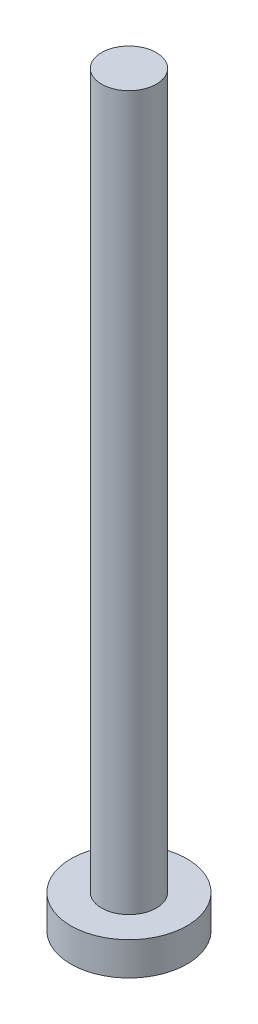
ISO-10303-21;
HEADER;
FILE_DESCRIPTION(('STEP AP214'),'2;1');
FILE_NAME('part.step','',(''),(''),'','','');
FILE_SCHEMA(('AUTOMOTIVE_DESIGN { 1 0 10303 214 1 1 1 1 }'));
ENDSEC;
DATA;
#1=APPLICATION_CONTEXT('core data for automotive mechanical design processes');
#2=APPLICATION_PROTOCOL_DEFINITION('international standard','automotive_design',2000,#1);
#3=PRODUCT_CONTEXT('',#1,'mechanical');
#4=PRODUCT('Part','Part','',(#3));
#5=PRODUCT_RELATED_PRODUCT_CATEGORY('part','',(#4));
#6=PRODUCT_DEFINITION_FORMATION('','',#4);
#7=PRODUCT_DEFINITION_CONTEXT('part definition',#1,'design');
#8=PRODUCT_DEFINITION('design','',#6,#7);
#9=PRODUCT_DEFINITION_SHAPE('','',#8);
#10=(LENGTH_UNIT() NAMED_UNIT(*) SI_UNIT(.MILLI.,.METRE.));
#11=(NAMED_UNIT(*) PLANE_ANGLE_UNIT() SI_UNIT($,.RADIAN.));
#12=(NAMED_UNIT(*) SI_UNIT($,.STERADIAN.) SOLID_ANGLE_UNIT());
#13=UNCERTAINTY_MEASURE_WITH_UNIT(LENGTH_MEASURE(1.E-05),#10,'distance_accuracy_value','');
#14=(GEOMETRIC_REPRESENTATION_CONTEXT(3) GLOBAL_UNCERTAINTY_ASSIGNED_CONTEXT((#13)) GLOBAL_UNIT_ASSIGNED_CONTEXT((#10,
#11,#12)) REPRESENTATION_CONTEXT('',''));
#15=CARTESIAN_POINT('',(0.,0.,0.));
#16=DIRECTION('',(0.,0.,1.));
#17=DIRECTION('',(1.,0.,0.));
#18=AXIS2_PLACEMENT_3D('',#15,#16,#17);
#19=CARTESIAN_POINT('',(0.,4.,0.));
#20=DIRECTION('',(0.,-1.,0.));
#21=DIRECTION('',(0.,0.,-1.));
#22=AXIS2_PLACEMENT_3D('',#19,#20,#21);
#23=CYLINDRICAL_SURFACE('',#22,7.);
#24=CARTESIAN_POINT('',(0.,4.,0.));
#25=DIRECTION('',(0.,1.,0.));
#26=DIRECTION('',(0.,0.,1.));
#27=AXIS2_PLACEMENT_3D('',#24,#25,#26);
#28=CIRCLE('',#27,7.);
#29=CARTESIAN_POINT('',(0.,4.,7.));
#30=VERTEX_POINT('',#29);
#31=EDGE_CURVE('E51',#30,#30,#28,.T.);
#32=ORIENTED_EDGE('',*,*,#31,.F.);
#33=EDGE_LOOP('',(#32));
#34=FACE_BOUND('',#33,.T.);
#35=CARTESIAN_POINT('',(0.,0.,0.));
#36=DIRECTION('',(0.,1.,0.));
#37=DIRECTION('',(0.,0.,1.));
#38=AXIS2_PLACEMENT_3D('',#35,#36,#37);
#39=CIRCLE('',#38,7.);
#40=CARTESIAN_POINT('',(0.,0.,7.));
#41=VERTEX_POINT('',#40);
#42=EDGE_CURVE('E46',#41,#41,#39,.T.);
#43=ORIENTED_EDGE('',*,*,#42,.T.);
#44=EDGE_LOOP('',(#43));
#45=FACE_BOUND('',#44,.T.);
#46=ADVANCED_FACE('F43',(#34,#45),#23,.T.);
#47=CARTESIAN_POINT('',(0.,4.,0.));
#48=DIRECTION('',(0.,1.,0.));
#49=DIRECTION('',(0.,0.,1.));
#50=AXIS2_PLACEMENT_3D('',#47,#48,#49);
#51=PLANE('',#50);
#52=CARTESIAN_POINT('',(0.,4.,0.));
#53=DIRECTION('',(0.,1.,0.));
#54=DIRECTION('',(0.,0.,1.));
#55=AXIS2_PLACEMENT_3D('',#52,#53,#54);
#56=CIRCLE('',#55,3.3);
#57=CARTESIAN_POINT('',(0.,4.,3.3));
#58=VERTEX_POINT('',#57);
#59=EDGE_CURVE('E10',#58,#58,#56,.T.);
#60=ORIENTED_EDGE('',*,*,#59,.F.);
#61=EDGE_LOOP('',(#60));
#62=FACE_BOUND('',#61,.T.);
#63=ORIENTED_EDGE('',*,*,#31,.T.);
#64=EDGE_LOOP('',(#63));
#65=FACE_BOUND('',#64,.T.);
#66=ADVANCED_FACE('F71',(#62,#65),#51,.T.);
#67=CARTESIAN_POINT('',(0.,0.,0.));
#68=DIRECTION('',(0.,1.,0.));
#69=DIRECTION('',(0.,0.,1.));
#70=AXIS2_PLACEMENT_3D('',#67,#68,#69);
#71=PLANE('',#70);
#72=ORIENTED_EDGE('',*,*,#42,.F.);
#73=EDGE_LOOP('',(#72));
#74=FACE_BOUND('',#73,.T.);
#75=ADVANCED_FACE('F68',(#74),#71,.F.);
#76=CARTESIAN_POINT('',(0.,90.,0.));
#77=DIRECTION('',(0.,-1.,0.));
#78=DIRECTION('',(0.,0.,-1.));
#79=AXIS2_PLACEMENT_3D('',#76,#77,#78);
#80=CYLINDRICAL_SURFACE('',#79,3.3);
#81=CARTESIAN_POINT('',(0.,90.,0.));
#82=DIRECTION('',(0.,1.,0.));
#83=DIRECTION('',(0.,0.,1.));
#84=AXIS2_PLACEMENT_3D('',#81,#82,#83);
#85=CIRCLE('',#84,3.3);
#86=CARTESIAN_POINT('',(0.,90.,3.3));
#87=VERTEX_POINT('',#86);
#88=EDGE_CURVE('E58',#87,#87,#85,.T.);
#89=ORIENTED_EDGE('',*,*,#88,.F.);
#90=EDGE_LOOP('',(#89));
#91=FACE_BOUND('',#90,.T.);
#92=ORIENTED_EDGE('',*,*,#59,.T.);
#93=EDGE_LOOP('',(#92));
#94=FACE_BOUND('',#93,.T.);
#95=ADVANCED_FACE('F70',(#91,#94),#80,.T.);
#96=CARTESIAN_POINT('',(0.,90.,0.));
#97=DIRECTION('',(0.,1.,0.));
#98=DIRECTION('',(0.,0.,1.));
#99=AXIS2_PLACEMENT_3D('',#96,#97,#98);
#100=PLANE('',#99);
#101=ORIENTED_EDGE('',*,*,#88,.T.);
#102=EDGE_LOOP('',(#101));
#103=FACE_BOUND('',#102,.T.);
#104=ADVANCED_FACE('F77',(#103),#100,.T.);
#105=CLOSED_SHELL('',(#46,#66,#75,#95,#104));
#106=MANIFOLD_SOLID_BREP('B2',#105);
#107=ADVANCED_BREP_SHAPE_REPRESENTATION('',(#18,#106),#14);
#108=SHAPE_DEFINITION_REPRESENTATION(#9,#107);
ENDSEC;
END-ISO-10303-21;
